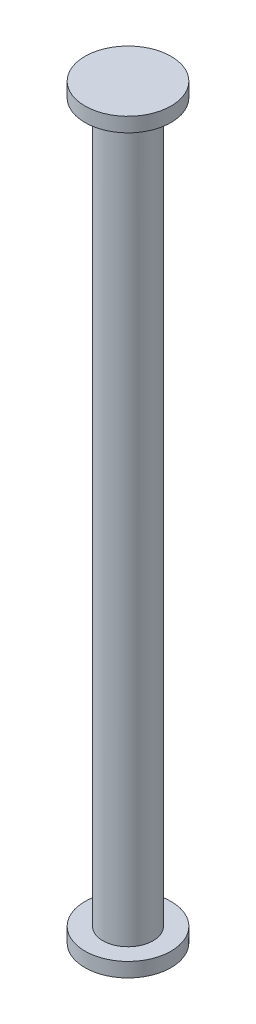
ISO-10303-21;
HEADER;
FILE_DESCRIPTION(('STEP AP214'),'2;1');
FILE_NAME('part.step','',(''),(''),'','','');
FILE_SCHEMA(('AUTOMOTIVE_DESIGN { 1 0 10303 214 1 1 1 1 }'));
ENDSEC;
DATA;
#1=APPLICATION_CONTEXT('core data for automotive mechanical design processes');
#2=APPLICATION_PROTOCOL_DEFINITION('international standard','automotive_design',2000,#1);
#3=PRODUCT_CONTEXT('',#1,'mechanical');
#4=PRODUCT('Part','Part','',(#3));
#5=PRODUCT_RELATED_PRODUCT_CATEGORY('part','',(#4));
#6=PRODUCT_DEFINITION_FORMATION('','',#4);
#7=PRODUCT_DEFINITION_CONTEXT('part definition',#1,'design');
#8=PRODUCT_DEFINITION('design','',#6,#7);
#9=PRODUCT_DEFINITION_SHAPE('','',#8);
#10=(LENGTH_UNIT() NAMED_UNIT(*) SI_UNIT(.MILLI.,.METRE.));
#11=(NAMED_UNIT(*) PLANE_ANGLE_UNIT() SI_UNIT($,.RADIAN.));
#12=(NAMED_UNIT(*) SI_UNIT($,.STERADIAN.) SOLID_ANGLE_UNIT());
#13=UNCERTAINTY_MEASURE_WITH_UNIT(LENGTH_MEASURE(1.E-05),#10,'distance_accuracy_value','');
#14=(GEOMETRIC_REPRESENTATION_CONTEXT(3) GLOBAL_UNCERTAINTY_ASSIGNED_CONTEXT((#13)) GLOBAL_UNIT_ASSIGNED_CONTEXT((#10,
#11,#12)) REPRESENTATION_CONTEXT('',''));
#15=CARTESIAN_POINT('',(0.,0.,0.));
#16=DIRECTION('',(0.,0.,1.));
#17=DIRECTION('',(1.,0.,0.));
#18=AXIS2_PLACEMENT_3D('',#15,#16,#17);
#19=CARTESIAN_POINT('',(0.,127.,0.));
#20=DIRECTION('',(0.,-1.,0.));
#21=DIRECTION('',(0.,0.,-1.));
#22=AXIS2_PLACEMENT_3D('',#19,#20,#21);
#23=CYLINDRICAL_SURFACE('',#22,4.445);
#24=CARTESIAN_POINT('',(0.,127.,0.));
#25=DIRECTION('',(0.,1.,0.));
#26=DIRECTION('',(0.,0.,1.));
#27=AXIS2_PLACEMENT_3D('',#24,#25,#26);
#28=CIRCLE('',#27,4.445);
#29=CARTESIAN_POINT('',(0.,127.,4.445));
#30=VERTEX_POINT('',#29);
#31=EDGE_CURVE('E10',#30,#30,#28,.T.);
#32=ORIENTED_EDGE('',*,*,#31,.F.);
#33=EDGE_LOOP('',(#32));
#34=FACE_BOUND('',#33,.T.);
#35=CARTESIAN_POINT('',(0.,0.,0.));
#36=DIRECTION('',(0.,-1.,0.));
#37=DIRECTION('',(0.,0.,-1.));
#38=AXIS2_PLACEMENT_3D('',#35,#36,#37);
#39=CIRCLE('',#38,4.445);
#40=CARTESIAN_POINT('',(0.,0.,-4.445));
#41=VERTEX_POINT('',#40);
#42=EDGE_CURVE('E39',#41,#41,#39,.T.);
#43=ORIENTED_EDGE('',*,*,#42,.F.);
#44=EDGE_LOOP('',(#43));
#45=FACE_BOUND('',#44,.T.);
#46=ADVANCED_FACE('F33',(#34,#45),#23,.T.);
#47=CARTESIAN_POINT('',(0.,-2.54,0.));
#48=DIRECTION('',(0.,1.,0.));
#49=DIRECTION('',(0.,0.,1.));
#50=AXIS2_PLACEMENT_3D('',#47,#48,#49);
#51=CYLINDRICAL_SURFACE('',#50,7.62);
#52=CARTESIAN_POINT('',(0.,-2.54,0.));
#53=DIRECTION('',(0.,-1.,0.));
#54=DIRECTION('',(0.,0.,-1.));
#55=AXIS2_PLACEMENT_3D('',#52,#53,#54);
#56=CIRCLE('',#55,7.62);
#57=CARTESIAN_POINT('',(0.,-2.54,-7.62));
#58=VERTEX_POINT('',#57);
#59=EDGE_CURVE('E43',#58,#58,#56,.T.);
#60=ORIENTED_EDGE('',*,*,#59,.F.);
#61=EDGE_LOOP('',(#60));
#62=FACE_BOUND('',#61,.T.);
#63=CARTESIAN_POINT('',(0.,0.,0.));
#64=DIRECTION('',(0.,-1.,0.));
#65=DIRECTION('',(0.,0.,-1.));
#66=AXIS2_PLACEMENT_3D('',#63,#64,#65);
#67=CIRCLE('',#66,7.62);
#68=CARTESIAN_POINT('',(0.,0.,-7.62));
#69=VERTEX_POINT('',#68);
#70=EDGE_CURVE('E47',#69,#69,#67,.T.);
#71=ORIENTED_EDGE('',*,*,#70,.T.);
#72=EDGE_LOOP('',(#71));
#73=FACE_BOUND('',#72,.T.);
#74=ADVANCED_FACE('F76',(#62,#73),#51,.T.);
#75=CARTESIAN_POINT('',(0.,-2.54,0.));
#76=DIRECTION('',(0.,-1.,0.));
#77=DIRECTION('',(0.,0.,-1.));
#78=AXIS2_PLACEMENT_3D('',#75,#76,#77);
#79=PLANE('',#78);
#80=ORIENTED_EDGE('',*,*,#59,.T.);
#81=EDGE_LOOP('',(#80));
#82=FACE_BOUND('',#81,.T.);
#83=ADVANCED_FACE('F81',(#82),#79,.T.);
#84=CARTESIAN_POINT('',(0.,0.,0.));
#85=DIRECTION('',(0.,-1.,0.));
#86=DIRECTION('',(0.,0.,-1.));
#87=AXIS2_PLACEMENT_3D('',#84,#85,#86);
#88=PLANE('',#87);
#89=ORIENTED_EDGE('',*,*,#42,.T.);
#90=EDGE_LOOP('',(#89));
#91=FACE_BOUND('',#90,.T.);
#92=ORIENTED_EDGE('',*,*,#70,.F.);
#93=EDGE_LOOP('',(#92));
#94=FACE_BOUND('',#93,.T.);
#95=ADVANCED_FACE('F64',(#91,#94),#88,.F.);
#96=CARTESIAN_POINT('',(0.,129.54,0.));
#97=DIRECTION('',(0.,-1.,0.));
#98=DIRECTION('',(0.,0.,-1.));
#99=AXIS2_PLACEMENT_3D('',#96,#97,#98);
#100=CYLINDRICAL_SURFACE('',#99,7.62);
#101=CARTESIAN_POINT('',(0.,129.54,0.));
#102=DIRECTION('',(0.,1.,0.));
#103=DIRECTION('',(0.,0.,1.));
#104=AXIS2_PLACEMENT_3D('',#101,#102,#103);
#105=CIRCLE('',#104,7.62);
#106=CARTESIAN_POINT('',(0.,129.54,7.62));
#107=VERTEX_POINT('',#106);
#108=EDGE_CURVE('E51',#107,#107,#105,.T.);
#109=ORIENTED_EDGE('',*,*,#108,.F.);
#110=EDGE_LOOP('',(#109));
#111=FACE_BOUND('',#110,.T.);
#112=CARTESIAN_POINT('',(0.,127.,0.));
#113=DIRECTION('',(0.,1.,0.));
#114=DIRECTION('',(0.,0.,1.));
#115=AXIS2_PLACEMENT_3D('',#112,#113,#114);
#116=CIRCLE('',#115,7.62);
#117=CARTESIAN_POINT('',(0.,127.,7.62));
#118=VERTEX_POINT('',#117);
#119=EDGE_CURVE('E53',#118,#118,#116,.T.);
#120=ORIENTED_EDGE('',*,*,#119,.T.);
#121=EDGE_LOOP('',(#120));
#122=FACE_BOUND('',#121,.T.);
#123=ADVANCED_FACE('F61',(#111,#122),#100,.T.);
#124=CARTESIAN_POINT('',(0.,129.54,0.));
#125=DIRECTION('',(0.,1.,0.));
#126=DIRECTION('',(0.,0.,1.));
#127=AXIS2_PLACEMENT_3D('',#124,#125,#126);
#128=PLANE('',#127);
#129=ORIENTED_EDGE('',*,*,#108,.T.);
#130=EDGE_LOOP('',(#129));
#131=FACE_BOUND('',#130,.T.);
#132=ADVANCED_FACE('F59',(#131),#128,.T.);
#133=CARTESIAN_POINT('',(0.,127.,0.));
#134=DIRECTION('',(0.,1.,0.));
#135=DIRECTION('',(0.,0.,1.));
#136=AXIS2_PLACEMENT_3D('',#133,#134,#135);
#137=PLANE('',#136);
#138=ORIENTED_EDGE('',*,*,#31,.T.);
#139=EDGE_LOOP('',(#138));
#140=FACE_BOUND('',#139,.T.);
#141=ORIENTED_EDGE('',*,*,#119,.F.);
#142=EDGE_LOOP('',(#141));
#143=FACE_BOUND('',#142,.T.);
#144=ADVANCED_FACE('F68',(#140,#143),#137,.F.);
#145=CLOSED_SHELL('',(#46,#74,#83,#95,#123,#132,#144));
#146=MANIFOLD_SOLID_BREP('B2',#145);
#147=ADVANCED_BREP_SHAPE_REPRESENTATION('',(#18,#146),#14);
#148=SHAPE_DEFINITION_REPRESENTATION(#9,#147);
ENDSEC;
END-ISO-10303-21;
